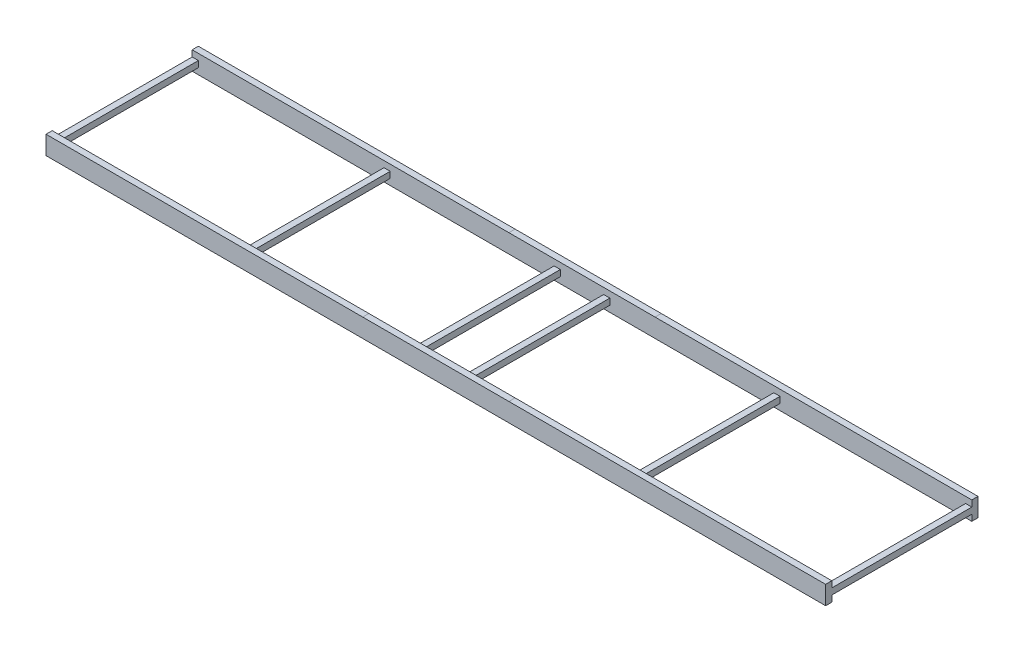
ISO-10303-21;
HEADER;
FILE_DESCRIPTION(('STEP AP214'),'2;1');
FILE_NAME('part.step','',(''),(''),'','','');
FILE_SCHEMA(('AUTOMOTIVE_DESIGN { 1 0 10303 214 1 1 1 1 }'));
ENDSEC;
DATA;
#1=APPLICATION_CONTEXT('core data for automotive mechanical design processes');
#2=APPLICATION_PROTOCOL_DEFINITION('international standard','automotive_design',2000,#1);
#3=PRODUCT_CONTEXT('',#1,'mechanical');
#4=PRODUCT('Part','Part','',(#3));
#5=PRODUCT_RELATED_PRODUCT_CATEGORY('part','',(#4));
#6=PRODUCT_DEFINITION_FORMATION('','',#4);
#7=PRODUCT_DEFINITION_CONTEXT('part definition',#1,'design');
#8=PRODUCT_DEFINITION('design','',#6,#7);
#9=PRODUCT_DEFINITION_SHAPE('','',#8);
#10=(LENGTH_UNIT() NAMED_UNIT(*) SI_UNIT(.MILLI.,.METRE.));
#11=(NAMED_UNIT(*) PLANE_ANGLE_UNIT() SI_UNIT($,.RADIAN.));
#12=(NAMED_UNIT(*) SI_UNIT($,.STERADIAN.) SOLID_ANGLE_UNIT());
#13=UNCERTAINTY_MEASURE_WITH_UNIT(LENGTH_MEASURE(1.E-05),#10,'distance_accuracy_value','');
#14=(GEOMETRIC_REPRESENTATION_CONTEXT(3) GLOBAL_UNCERTAINTY_ASSIGNED_CONTEXT((#13)) GLOBAL_UNIT_ASSIGNED_CONTEXT((#10,
#11,#12)) REPRESENTATION_CONTEXT('',''));
#15=CARTESIAN_POINT('',(0.,0.,0.));
#16=DIRECTION('',(0.,0.,1.));
#17=DIRECTION('',(1.,0.,0.));
#18=AXIS2_PLACEMENT_3D('',#15,#16,#17);
#19=CARTESIAN_POINT('',(-101.5875,4.7625,39.0875));
#20=DIRECTION('',(1.,0.,0.));
#21=DIRECTION('',(0.,0.,-1.));
#22=AXIS2_PLACEMENT_3D('',#19,#20,#21);
#23=PLANE('',#22);
#24=DIRECTION('',(0.,1.,0.));
#25=VECTOR('',#24,1.);
#26=CARTESIAN_POINT('',(-101.5875,4.7625,35.9125));
#27=LINE('',#26,#25);
#28=CARTESIAN_POINT('',(-101.5875,1.5875,35.9125));
#29=VERTEX_POINT('',#28);
#30=CARTESIAN_POINT('',(-101.5875,4.7625,35.9125));
#31=VERTEX_POINT('',#30);
#32=EDGE_CURVE('E506',#29,#31,#27,.T.);
#33=ORIENTED_EDGE('',*,*,#32,.T.);
#34=DIRECTION('',(0.,0.,-1.));
#35=VECTOR('',#34,1.);
#36=CARTESIAN_POINT('',(-101.5875,4.7625,39.0875));
#37=LINE('',#36,#35);
#38=CARTESIAN_POINT('',(-101.5875,4.7625,-35.9125));
#39=VERTEX_POINT('',#38);
#40=EDGE_CURVE('E490',#31,#39,#37,.T.);
#41=ORIENTED_EDGE('',*,*,#40,.T.);
#42=DIRECTION('',(0.,1.,0.));
#43=VECTOR('',#42,1.);
#44=CARTESIAN_POINT('',(-101.5875,4.7625,-35.9125));
#45=LINE('',#44,#43);
#46=CARTESIAN_POINT('',(-101.5875,1.5875,-35.9125));
#47=VERTEX_POINT('',#46);
#48=EDGE_CURVE('E54',#47,#39,#45,.T.);
#49=ORIENTED_EDGE('',*,*,#48,.F.);
#50=DIRECTION('',(0.,0.,-1.));
#51=VECTOR('',#50,1.);
#52=CARTESIAN_POINT('',(-101.5875,1.5875,39.0875));
#53=LINE('',#52,#51);
#54=EDGE_CURVE('E11',#29,#47,#53,.T.);
#55=ORIENTED_EDGE('',*,*,#54,.F.);
#56=EDGE_LOOP('',(#33,#41,#49,#55));
#57=FACE_BOUND('',#56,.T.);
#58=ADVANCED_FACE('F40',(#57),#23,.F.);
#59=CARTESIAN_POINT('',(-101.5875,1.5875,39.0875));
#60=DIRECTION('',(0.,1.,0.));
#61=DIRECTION('',(0.,0.,1.));
#62=AXIS2_PLACEMENT_3D('',#59,#60,#61);
#63=PLANE('',#62);
#64=DIRECTION('',(-1.,0.,0.));
#65=VECTOR('',#64,1.);
#66=CARTESIAN_POINT('',(200.,1.5875,35.9125));
#67=LINE('',#66,#65);
#68=CARTESIAN_POINT('',(-98.4125,1.5875,35.9125));
#69=VERTEX_POINT('',#68);
#70=EDGE_CURVE('E60',#69,#29,#67,.T.);
#71=ORIENTED_EDGE('',*,*,#70,.T.);
#72=ORIENTED_EDGE('',*,*,#54,.T.);
#73=DIRECTION('',(-1.,0.,0.));
#74=VECTOR('',#73,1.);
#75=CARTESIAN_POINT('',(200.,1.5875,-35.9125));
#76=LINE('',#75,#74);
#77=CARTESIAN_POINT('',(-98.4125,1.5875,-35.9125));
#78=VERTEX_POINT('',#77);
#79=EDGE_CURVE('E365',#78,#47,#76,.T.);
#80=ORIENTED_EDGE('',*,*,#79,.F.);
#81=DIRECTION('',(0.,0.,-1.));
#82=VECTOR('',#81,1.);
#83=CARTESIAN_POINT('',(-98.4125,1.5875,39.0875));
#84=LINE('',#83,#82);
#85=EDGE_CURVE('E47',#69,#78,#84,.T.);
#86=ORIENTED_EDGE('',*,*,#85,.F.);
#87=EDGE_LOOP('',(#71,#72,#80,#86));
#88=FACE_BOUND('',#87,.T.);
#89=ADVANCED_FACE('F766',(#88),#63,.F.);
#90=CARTESIAN_POINT('',(-98.4125,4.7625,39.0875));
#91=DIRECTION('',(-1.,0.,0.));
#92=DIRECTION('',(0.,0.,1.));
#93=AXIS2_PLACEMENT_3D('',#90,#91,#92);
#94=PLANE('',#93);
#95=DIRECTION('',(0.,1.,0.));
#96=VECTOR('',#95,1.);
#97=CARTESIAN_POINT('',(-98.4125,4.7625,35.9125));
#98=LINE('',#97,#96);
#99=CARTESIAN_POINT('',(-98.4125,4.7625,35.9125));
#100=VERTEX_POINT('',#99);
#101=EDGE_CURVE('E500',#69,#100,#98,.T.);
#102=ORIENTED_EDGE('',*,*,#101,.F.);
#103=ORIENTED_EDGE('',*,*,#85,.T.);
#104=DIRECTION('',(0.,1.,0.));
#105=VECTOR('',#104,1.);
#106=CARTESIAN_POINT('',(-98.4125,4.7625,-35.9125));
#107=LINE('',#106,#105);
#108=CARTESIAN_POINT('',(-98.4125,4.7625,-35.9125));
#109=VERTEX_POINT('',#108);
#110=EDGE_CURVE('E400',#78,#109,#107,.T.);
#111=ORIENTED_EDGE('',*,*,#110,.T.);
#112=DIRECTION('',(0.,0.,-1.));
#113=VECTOR('',#112,1.);
#114=CARTESIAN_POINT('',(-98.4125,4.7625,39.0875));
#115=LINE('',#114,#113);
#116=EDGE_CURVE('E492',#100,#109,#115,.T.);
#117=ORIENTED_EDGE('',*,*,#116,.F.);
#118=EDGE_LOOP('',(#102,#103,#111,#117));
#119=FACE_BOUND('',#118,.T.);
#120=ADVANCED_FACE('F496',(#119),#94,.F.);
#121=CARTESIAN_POINT('',(-101.5875,4.7625,39.0875));
#122=DIRECTION('',(0.,-1.,0.));
#123=DIRECTION('',(0.,0.,-1.));
#124=AXIS2_PLACEMENT_3D('',#121,#122,#123);
#125=PLANE('',#124);
#126=DIRECTION('',(-1.,0.,0.));
#127=VECTOR('',#126,1.);
#128=CARTESIAN_POINT('',(200.,4.7625,35.9125));
#129=LINE('',#128,#127);
#130=EDGE_CURVE('E512',#100,#31,#129,.T.);
#131=ORIENTED_EDGE('',*,*,#130,.F.);
#132=ORIENTED_EDGE('',*,*,#116,.T.);
#133=DIRECTION('',(-1.,0.,0.));
#134=VECTOR('',#133,1.);
#135=CARTESIAN_POINT('',(200.,4.7625,-35.9125));
#136=LINE('',#135,#134);
#137=EDGE_CURVE('E371',#109,#39,#136,.T.);
#138=ORIENTED_EDGE('',*,*,#137,.T.);
#139=ORIENTED_EDGE('',*,*,#40,.F.);
#140=EDGE_LOOP('',(#131,#132,#138,#139));
#141=FACE_BOUND('',#140,.T.);
#142=ADVANCED_FACE('F503',(#141),#125,.F.);
#143=CARTESIAN_POINT('',(-14.2875,4.7625,39.0875));
#144=DIRECTION('',(1.,0.,0.));
#145=DIRECTION('',(0.,0.,-1.));
#146=AXIS2_PLACEMENT_3D('',#143,#144,#145);
#147=PLANE('',#146);
#148=DIRECTION('',(0.,1.,0.));
#149=VECTOR('',#148,1.);
#150=CARTESIAN_POINT('',(-14.2875,4.7625,35.9125));
#151=LINE('',#150,#149);
#152=CARTESIAN_POINT('',(-14.2875,1.5875,35.9125));
#153=VERTEX_POINT('',#152);
#154=CARTESIAN_POINT('',(-14.2875,4.7625,35.9125));
#155=VERTEX_POINT('',#154);
#156=EDGE_CURVE('E529',#153,#155,#151,.T.);
#157=ORIENTED_EDGE('',*,*,#156,.T.);
#158=DIRECTION('',(0.,0.,-1.));
#159=VECTOR('',#158,1.);
#160=CARTESIAN_POINT('',(-14.2875,4.7625,39.0875));
#161=LINE('',#160,#159);
#162=CARTESIAN_POINT('',(-14.2875,4.7625,-35.9125));
#163=VERTEX_POINT('',#162);
#164=EDGE_CURVE('E480',#155,#163,#161,.T.);
#165=ORIENTED_EDGE('',*,*,#164,.T.);
#166=DIRECTION('',(0.,1.,0.));
#167=VECTOR('',#166,1.);
#168=CARTESIAN_POINT('',(-14.2875,4.7625,-35.9125));
#169=LINE('',#168,#167);
#170=CARTESIAN_POINT('',(-14.2875,1.5875,-35.9125));
#171=VERTEX_POINT('',#170);
#172=EDGE_CURVE('E376',#171,#163,#169,.T.);
#173=ORIENTED_EDGE('',*,*,#172,.F.);
#174=DIRECTION('',(0.,0.,-1.));
#175=VECTOR('',#174,1.);
#176=CARTESIAN_POINT('',(-14.2875,1.5875,39.0875));
#177=LINE('',#176,#175);
#178=EDGE_CURVE('E487',#153,#171,#177,.T.);
#179=ORIENTED_EDGE('',*,*,#178,.F.);
#180=EDGE_LOOP('',(#157,#165,#173,#179));
#181=FACE_BOUND('',#180,.T.);
#182=ADVANCED_FACE('F776',(#181),#147,.F.);
#183=CARTESIAN_POINT('',(-14.2875,1.5875,39.0875));
#184=DIRECTION('',(0.,1.,0.));
#185=DIRECTION('',(0.,0.,1.));
#186=AXIS2_PLACEMENT_3D('',#183,#184,#185);
#187=PLANE('',#186);
#188=CARTESIAN_POINT('',(-11.1125,1.5875,35.9125));
#189=VERTEX_POINT('',#188);
#190=EDGE_CURVE('E552',#189,#153,#67,.T.);
#191=ORIENTED_EDGE('',*,*,#190,.T.);
#192=ORIENTED_EDGE('',*,*,#178,.T.);
#193=CARTESIAN_POINT('',(-11.1125,1.5875,-35.9125));
#194=VERTEX_POINT('',#193);
#195=EDGE_CURVE('E361',#194,#171,#76,.T.);
#196=ORIENTED_EDGE('',*,*,#195,.F.);
#197=DIRECTION('',(0.,0.,-1.));
#198=VECTOR('',#197,1.);
#199=CARTESIAN_POINT('',(-11.1125,1.5875,39.0875));
#200=LINE('',#199,#198);
#201=EDGE_CURVE('E485',#189,#194,#200,.T.);
#202=ORIENTED_EDGE('',*,*,#201,.F.);
#203=EDGE_LOOP('',(#191,#192,#196,#202));
#204=FACE_BOUND('',#203,.T.);
#205=ADVANCED_FACE('F684',(#204),#187,.F.);
#206=CARTESIAN_POINT('',(-11.1125,4.7625,39.0875));
#207=DIRECTION('',(-1.,0.,0.));
#208=DIRECTION('',(0.,0.,1.));
#209=AXIS2_PLACEMENT_3D('',#206,#207,#208);
#210=PLANE('',#209);
#211=DIRECTION('',(0.,1.,0.));
#212=VECTOR('',#211,1.);
#213=CARTESIAN_POINT('',(-11.1125,4.7625,35.9125));
#214=LINE('',#213,#212);
#215=CARTESIAN_POINT('',(-11.1125,4.7625,35.9125));
#216=VERTEX_POINT('',#215);
#217=EDGE_CURVE('E554',#189,#216,#214,.T.);
#218=ORIENTED_EDGE('',*,*,#217,.F.);
#219=ORIENTED_EDGE('',*,*,#201,.T.);
#220=DIRECTION('',(0.,1.,0.));
#221=VECTOR('',#220,1.);
#222=CARTESIAN_POINT('',(-11.1125,4.7625,-35.9125));
#223=LINE('',#222,#221);
#224=CARTESIAN_POINT('',(-11.1125,4.7625,-35.9125));
#225=VERTEX_POINT('',#224);
#226=EDGE_CURVE('E369',#194,#225,#223,.T.);
#227=ORIENTED_EDGE('',*,*,#226,.T.);
#228=DIRECTION('',(0.,0.,-1.));
#229=VECTOR('',#228,1.);
#230=CARTESIAN_POINT('',(-11.1125,4.7625,39.0875));
#231=LINE('',#230,#229);
#232=EDGE_CURVE('E483',#216,#225,#231,.T.);
#233=ORIENTED_EDGE('',*,*,#232,.F.);
#234=EDGE_LOOP('',(#218,#219,#227,#233));
#235=FACE_BOUND('',#234,.T.);
#236=ADVANCED_FACE('F686',(#235),#210,.F.);
#237=CARTESIAN_POINT('',(-14.2875,4.7625,39.0875));
#238=DIRECTION('',(0.,-1.,0.));
#239=DIRECTION('',(0.,0.,-1.));
#240=AXIS2_PLACEMENT_3D('',#237,#238,#239);
#241=PLANE('',#240);
#242=EDGE_CURVE('E515',#216,#155,#129,.T.);
#243=ORIENTED_EDGE('',*,*,#242,.F.);
#244=ORIENTED_EDGE('',*,*,#232,.T.);
#245=EDGE_CURVE('E374',#225,#163,#136,.T.);
#246=ORIENTED_EDGE('',*,*,#245,.T.);
#247=ORIENTED_EDGE('',*,*,#164,.F.);
#248=EDGE_LOOP('',(#243,#244,#246,#247));
#249=FACE_BOUND('',#248,.T.);
#250=ADVANCED_FACE('F688',(#249),#241,.F.);
#251=CARTESIAN_POINT('',(11.1125,4.7625,39.0875));
#252=DIRECTION('',(1.,0.,0.));
#253=DIRECTION('',(0.,0.,-1.));
#254=AXIS2_PLACEMENT_3D('',#251,#252,#253);
#255=PLANE('',#254);
#256=DIRECTION('',(0.,1.,0.));
#257=VECTOR('',#256,1.);
#258=CARTESIAN_POINT('',(11.1125,4.7625,35.9125));
#259=LINE('',#258,#257);
#260=CARTESIAN_POINT('',(11.1125,1.5875,35.9125));
#261=VERTEX_POINT('',#260);
#262=CARTESIAN_POINT('',(11.1125,4.7625,35.9125));
#263=VERTEX_POINT('',#262);
#264=EDGE_CURVE('E464',#261,#263,#259,.T.);
#265=ORIENTED_EDGE('',*,*,#264,.T.);
#266=DIRECTION('',(0.,0.,-1.));
#267=VECTOR('',#266,1.);
#268=CARTESIAN_POINT('',(11.1125,4.7625,39.0875));
#269=LINE('',#268,#267);
#270=CARTESIAN_POINT('',(11.1125,4.7625,-35.9125));
#271=VERTEX_POINT('',#270);
#272=EDGE_CURVE('E456',#263,#271,#269,.T.);
#273=ORIENTED_EDGE('',*,*,#272,.T.);
#274=DIRECTION('',(0.,1.,0.));
#275=VECTOR('',#274,1.);
#276=CARTESIAN_POINT('',(11.1125,4.7625,-35.9125));
#277=LINE('',#276,#275);
#278=CARTESIAN_POINT('',(11.1125,1.5875,-35.9125));
#279=VERTEX_POINT('',#278);
#280=EDGE_CURVE('E398',#279,#271,#277,.T.);
#281=ORIENTED_EDGE('',*,*,#280,.F.);
#282=DIRECTION('',(0.,0.,-1.));
#283=VECTOR('',#282,1.);
#284=CARTESIAN_POINT('',(11.1125,1.5875,39.0875));
#285=LINE('',#284,#283);
#286=EDGE_CURVE('E478',#261,#279,#285,.T.);
#287=ORIENTED_EDGE('',*,*,#286,.F.);
#288=EDGE_LOOP('',(#265,#273,#281,#287));
#289=FACE_BOUND('',#288,.T.);
#290=ADVANCED_FACE('F460',(#289),#255,.F.);
#291=CARTESIAN_POINT('',(11.1125,1.5875,39.0875));
#292=DIRECTION('',(0.,1.,0.));
#293=DIRECTION('',(0.,0.,1.));
#294=AXIS2_PLACEMENT_3D('',#291,#292,#293);
#295=PLANE('',#294);
#296=CARTESIAN_POINT('',(14.2875,1.5875,35.9125));
#297=VERTEX_POINT('',#296);
#298=EDGE_CURVE('E580',#297,#261,#67,.T.);
#299=ORIENTED_EDGE('',*,*,#298,.T.);
#300=ORIENTED_EDGE('',*,*,#286,.T.);
#301=CARTESIAN_POINT('',(14.2875,1.5875,-35.9125));
#302=VERTEX_POINT('',#301);
#303=EDGE_CURVE('E344',#302,#279,#76,.T.);
#304=ORIENTED_EDGE('',*,*,#303,.F.);
#305=DIRECTION('',(0.,0.,-1.));
#306=VECTOR('',#305,1.);
#307=CARTESIAN_POINT('',(14.2875,1.5875,39.0875));
#308=LINE('',#307,#306);
#309=EDGE_CURVE('E468',#297,#302,#308,.T.);
#310=ORIENTED_EDGE('',*,*,#309,.F.);
#311=EDGE_LOOP('',(#299,#300,#304,#310));
#312=FACE_BOUND('',#311,.T.);
#313=ADVANCED_FACE('F679',(#312),#295,.F.);
#314=CARTESIAN_POINT('',(14.2875,4.7625,39.0875));
#315=DIRECTION('',(-1.,0.,0.));
#316=DIRECTION('',(0.,0.,1.));
#317=AXIS2_PLACEMENT_3D('',#314,#315,#316);
#318=PLANE('',#317);
#319=DIRECTION('',(0.,1.,0.));
#320=VECTOR('',#319,1.);
#321=CARTESIAN_POINT('',(14.2875,4.7625,35.9125));
#322=LINE('',#321,#320);
#323=CARTESIAN_POINT('',(14.2875,4.7625,35.9125));
#324=VERTEX_POINT('',#323);
#325=EDGE_CURVE('E559',#297,#324,#322,.T.);
#326=ORIENTED_EDGE('',*,*,#325,.F.);
#327=ORIENTED_EDGE('',*,*,#309,.T.);
#328=DIRECTION('',(0.,1.,0.));
#329=VECTOR('',#328,1.);
#330=CARTESIAN_POINT('',(14.2875,4.7625,-35.9125));
#331=LINE('',#330,#329);
#332=CARTESIAN_POINT('',(14.2875,4.7625,-35.9125));
#333=VERTEX_POINT('',#332);
#334=EDGE_CURVE('E413',#302,#333,#331,.T.);
#335=ORIENTED_EDGE('',*,*,#334,.T.);
#336=DIRECTION('',(0.,0.,-1.));
#337=VECTOR('',#336,1.);
#338=CARTESIAN_POINT('',(14.2875,4.7625,39.0875));
#339=LINE('',#338,#337);
#340=EDGE_CURVE('E458',#324,#333,#339,.T.);
#341=ORIENTED_EDGE('',*,*,#340,.F.);
#342=EDGE_LOOP('',(#326,#327,#335,#341));
#343=FACE_BOUND('',#342,.T.);
#344=ADVANCED_FACE('F676',(#343),#318,.F.);
#345=CARTESIAN_POINT('',(11.1125,4.7625,39.0875));
#346=DIRECTION('',(0.,-1.,0.));
#347=DIRECTION('',(0.,0.,-1.));
#348=AXIS2_PLACEMENT_3D('',#345,#346,#347);
#349=PLANE('',#348);
#350=EDGE_CURVE('E519',#324,#263,#129,.T.);
#351=ORIENTED_EDGE('',*,*,#350,.F.);
#352=ORIENTED_EDGE('',*,*,#340,.T.);
#353=EDGE_CURVE('E396',#333,#271,#136,.T.);
#354=ORIENTED_EDGE('',*,*,#353,.T.);
#355=ORIENTED_EDGE('',*,*,#272,.F.);
#356=EDGE_LOOP('',(#351,#352,#354,#355));
#357=FACE_BOUND('',#356,.T.);
#358=ADVANCED_FACE('F455',(#357),#349,.F.);
#359=CARTESIAN_POINT('',(98.4125,4.7625,39.0875));
#360=DIRECTION('',(1.,0.,0.));
#361=DIRECTION('',(0.,0.,-1.));
#362=AXIS2_PLACEMENT_3D('',#359,#360,#361);
#363=PLANE('',#362);
#364=DIRECTION('',(0.,1.,0.));
#365=VECTOR('',#364,1.);
#366=CARTESIAN_POINT('',(98.4125,4.7625,35.9125));
#367=LINE('',#366,#365);
#368=CARTESIAN_POINT('',(98.4125,1.5875,35.9125));
#369=VERTEX_POINT('',#368);
#370=CARTESIAN_POINT('',(98.4125,4.7625,35.9125));
#371=VERTEX_POINT('',#370);
#372=EDGE_CURVE('E556',#369,#371,#367,.T.);
#373=ORIENTED_EDGE('',*,*,#372,.T.);
#374=DIRECTION('',(0.,0.,-1.));
#375=VECTOR('',#374,1.);
#376=CARTESIAN_POINT('',(98.4125,4.7625,39.0875));
#377=LINE('',#376,#375);
#378=CARTESIAN_POINT('',(98.4125,4.7625,-35.9125));
#379=VERTEX_POINT('',#378);
#380=EDGE_CURVE('E659',#371,#379,#377,.T.);
#381=ORIENTED_EDGE('',*,*,#380,.T.);
#382=DIRECTION('',(0.,1.,0.));
#383=VECTOR('',#382,1.);
#384=CARTESIAN_POINT('',(98.4125,4.7625,-35.9125));
#385=LINE('',#384,#383);
#386=CARTESIAN_POINT('',(98.4125,1.5875,-35.9125));
#387=VERTEX_POINT('',#386);
#388=EDGE_CURVE('E406',#387,#379,#385,.T.);
#389=ORIENTED_EDGE('',*,*,#388,.F.);
#390=DIRECTION('',(0.,0.,-1.));
#391=VECTOR('',#390,1.);
#392=CARTESIAN_POINT('',(98.4125,1.5875,39.0875));
#393=LINE('',#392,#391);
#394=EDGE_CURVE('E466',#369,#387,#393,.T.);
#395=ORIENTED_EDGE('',*,*,#394,.F.);
#396=EDGE_LOOP('',(#373,#381,#389,#395));
#397=FACE_BOUND('',#396,.T.);
#398=ADVANCED_FACE('F674',(#397),#363,.F.);
#399=CARTESIAN_POINT('',(98.4125,1.5875,39.0875));
#400=DIRECTION('',(0.,1.,0.));
#401=DIRECTION('',(0.,0.,1.));
#402=AXIS2_PLACEMENT_3D('',#399,#400,#401);
#403=PLANE('',#402);
#404=CARTESIAN_POINT('',(101.5875,1.5875,35.9125));
#405=VERTEX_POINT('',#404);
#406=EDGE_CURVE('E581',#405,#369,#67,.T.);
#407=ORIENTED_EDGE('',*,*,#406,.T.);
#408=ORIENTED_EDGE('',*,*,#394,.T.);
#409=CARTESIAN_POINT('',(101.5875,1.5875,-35.9125));
#410=VERTEX_POINT('',#409);
#411=EDGE_CURVE('E340',#410,#387,#76,.T.);
#412=ORIENTED_EDGE('',*,*,#411,.F.);
#413=DIRECTION('',(0.,0.,-1.));
#414=VECTOR('',#413,1.);
#415=CARTESIAN_POINT('',(101.5875,1.5875,39.0875));
#416=LINE('',#415,#414);
#417=EDGE_CURVE('E471',#405,#410,#416,.T.);
#418=ORIENTED_EDGE('',*,*,#417,.F.);
#419=EDGE_LOOP('',(#407,#408,#412,#418));
#420=FACE_BOUND('',#419,.T.);
#421=ADVANCED_FACE('F673',(#420),#403,.F.);
#422=CARTESIAN_POINT('',(101.5875,4.7625,39.0875));
#423=DIRECTION('',(-1.,0.,0.));
#424=DIRECTION('',(0.,0.,1.));
#425=AXIS2_PLACEMENT_3D('',#422,#423,#424);
#426=PLANE('',#425);
#427=DIRECTION('',(0.,1.,0.));
#428=VECTOR('',#427,1.);
#429=CARTESIAN_POINT('',(101.5875,4.7625,35.9125));
#430=LINE('',#429,#428);
#431=CARTESIAN_POINT('',(101.5875,4.7625,35.9125));
#432=VERTEX_POINT('',#431);
#433=EDGE_CURVE('E569',#405,#432,#430,.T.);
#434=ORIENTED_EDGE('',*,*,#433,.F.);
#435=ORIENTED_EDGE('',*,*,#417,.T.);
#436=DIRECTION('',(0.,1.,0.));
#437=VECTOR('',#436,1.);
#438=CARTESIAN_POINT('',(101.5875,4.7625,-35.9125));
#439=LINE('',#438,#437);
#440=CARTESIAN_POINT('',(101.5875,4.7625,-35.9125));
#441=VERTEX_POINT('',#440);
#442=EDGE_CURVE('E422',#410,#441,#439,.T.);
#443=ORIENTED_EDGE('',*,*,#442,.T.);
#444=DIRECTION('',(0.,0.,-1.));
#445=VECTOR('',#444,1.);
#446=CARTESIAN_POINT('',(101.5875,4.7625,39.0875));
#447=LINE('',#446,#445);
#448=EDGE_CURVE('E666',#432,#441,#447,.T.);
#449=ORIENTED_EDGE('',*,*,#448,.F.);
#450=EDGE_LOOP('',(#434,#435,#443,#449));
#451=FACE_BOUND('',#450,.T.);
#452=ADVANCED_FACE('F670',(#451),#426,.F.);
#453=CARTESIAN_POINT('',(98.4125,4.7625,39.0875));
#454=DIRECTION('',(0.,-1.,0.));
#455=DIRECTION('',(0.,0.,-1.));
#456=AXIS2_PLACEMENT_3D('',#453,#454,#455);
#457=PLANE('',#456);
#458=EDGE_CURVE('E540',#432,#371,#129,.T.);
#459=ORIENTED_EDGE('',*,*,#458,.F.);
#460=ORIENTED_EDGE('',*,*,#448,.T.);
#461=EDGE_CURVE('E388',#441,#379,#136,.T.);
#462=ORIENTED_EDGE('',*,*,#461,.T.);
#463=ORIENTED_EDGE('',*,*,#380,.F.);
#464=EDGE_LOOP('',(#459,#460,#462,#463));
#465=FACE_BOUND('',#464,.T.);
#466=ADVANCED_FACE('F803',(#465),#457,.F.);
#467=CARTESIAN_POINT('',(-196.825,4.7625,-39.0875));
#468=DIRECTION('',(-1.,0.,0.));
#469=DIRECTION('',(0.,0.,1.));
#470=AXIS2_PLACEMENT_3D('',#467,#468,#469);
#471=PLANE('',#470);
#472=DIRECTION('',(0.,1.,0.));
#473=VECTOR('',#472,1.);
#474=CARTESIAN_POINT('',(-196.825,4.7625,35.9125));
#475=LINE('',#474,#473);
#476=CARTESIAN_POINT('',(-196.825,1.5875,35.9125));
#477=VERTEX_POINT('',#476);
#478=CARTESIAN_POINT('',(-196.825,4.7625,35.9125));
#479=VERTEX_POINT('',#478);
#480=EDGE_CURVE('E510',#477,#479,#475,.T.);
#481=ORIENTED_EDGE('',*,*,#480,.F.);
#482=DIRECTION('',(0.,0.,1.));
#483=VECTOR('',#482,1.);
#484=CARTESIAN_POINT('',(-196.825,1.5875,-39.0875));
#485=LINE('',#484,#483);
#486=CARTESIAN_POINT('',(-196.825,1.5875,-35.9125));
#487=VERTEX_POINT('',#486);
#488=EDGE_CURVE('E656',#487,#477,#485,.T.);
#489=ORIENTED_EDGE('',*,*,#488,.F.);
#490=DIRECTION('',(0.,1.,0.));
#491=VECTOR('',#490,1.);
#492=CARTESIAN_POINT('',(-196.825,4.7625,-35.9125));
#493=LINE('',#492,#491);
#494=CARTESIAN_POINT('',(-196.825,4.7625,-35.9125));
#495=VERTEX_POINT('',#494);
#496=EDGE_CURVE('E645',#487,#495,#493,.T.);
#497=ORIENTED_EDGE('',*,*,#496,.T.);
#498=DIRECTION('',(0.,0.,1.));
#499=VECTOR('',#498,1.);
#500=CARTESIAN_POINT('',(-196.825,4.7625,-39.0875));
#501=LINE('',#500,#499);
#502=EDGE_CURVE('E661',#495,#479,#501,.T.);
#503=ORIENTED_EDGE('',*,*,#502,.T.);
#504=EDGE_LOOP('',(#481,#489,#497,#503));
#505=FACE_BOUND('',#504,.T.);
#506=ADVANCED_FACE('F715',(#505),#471,.F.);
#507=CARTESIAN_POINT('',(-196.825,1.5875,-39.0875));
#508=DIRECTION('',(0.,1.,0.));
#509=DIRECTION('',(0.,0.,1.));
#510=AXIS2_PLACEMENT_3D('',#507,#508,#509);
#511=PLANE('',#510);
#512=CARTESIAN_POINT('',(-200.,1.5875,35.9125));
#513=VERTEX_POINT('',#512);
#514=EDGE_CURVE('E642',#477,#513,#67,.T.);
#515=ORIENTED_EDGE('',*,*,#514,.T.);
#516=DIRECTION('',(0.,0.,1.));
#517=VECTOR('',#516,1.);
#518=CARTESIAN_POINT('',(-200.,1.5875,-39.0875));
#519=LINE('',#518,#517);
#520=CARTESIAN_POINT('',(-200.,1.5875,-35.9125));
#521=VERTEX_POINT('',#520);
#522=EDGE_CURVE('E638',#521,#513,#519,.T.);
#523=ORIENTED_EDGE('',*,*,#522,.F.);
#524=EDGE_CURVE('E306',#487,#521,#76,.T.);
#525=ORIENTED_EDGE('',*,*,#524,.F.);
#526=ORIENTED_EDGE('',*,*,#488,.T.);
#527=EDGE_LOOP('',(#515,#523,#525,#526));
#528=FACE_BOUND('',#527,.T.);
#529=ADVANCED_FACE('F655',(#528),#511,.F.);
#530=CARTESIAN_POINT('',(-196.825,4.7625,-39.0875));
#531=DIRECTION('',(0.,-1.,0.));
#532=DIRECTION('',(0.,0.,-1.));
#533=AXIS2_PLACEMENT_3D('',#530,#531,#532);
#534=PLANE('',#533);
#535=CARTESIAN_POINT('',(-200.,4.7625,35.9125));
#536=VERTEX_POINT('',#535);
#537=EDGE_CURVE('E516',#479,#536,#129,.T.);
#538=ORIENTED_EDGE('',*,*,#537,.F.);
#539=ORIENTED_EDGE('',*,*,#502,.F.);
#540=CARTESIAN_POINT('',(-200.,4.7625,-35.9125));
#541=VERTEX_POINT('',#540);
#542=EDGE_CURVE('E375',#495,#541,#136,.T.);
#543=ORIENTED_EDGE('',*,*,#542,.T.);
#544=DIRECTION('',(0.,0.,1.));
#545=VECTOR('',#544,1.);
#546=CARTESIAN_POINT('',(-200.,4.7625,-39.0875));
#547=LINE('',#546,#545);
#548=EDGE_CURVE('E657',#541,#536,#547,.T.);
#549=ORIENTED_EDGE('',*,*,#548,.T.);
#550=EDGE_LOOP('',(#538,#539,#543,#549));
#551=FACE_BOUND('',#550,.T.);
#552=ADVANCED_FACE('F810',(#551),#534,.F.);
#553=CARTESIAN_POINT('',(-200.,4.7625,-39.0875));
#554=DIRECTION('',(1.,0.,0.));
#555=DIRECTION('',(0.,0.,-1.));
#556=AXIS2_PLACEMENT_3D('',#553,#554,#555);
#557=PLANE('',#556);
#558=DIRECTION('',(0.,1.,0.));
#559=VECTOR('',#558,1.);
#560=CARTESIAN_POINT('',(-200.,4.7625,39.0875));
#561=LINE('',#560,#559);
#562=CARTESIAN_POINT('',(-200.,-1.5875,39.0875));
#563=VERTEX_POINT('',#562);
#564=CARTESIAN_POINT('',(-200.,7.9375,39.0875));
#565=VERTEX_POINT('',#564);
#566=EDGE_CURVE('E711',#563,#565,#561,.T.);
#567=ORIENTED_EDGE('',*,*,#566,.T.);
#568=DIRECTION('',(0.,0.,1.));
#569=VECTOR('',#568,1.);
#570=CARTESIAN_POINT('',(-200.,7.9375,39.0875));
#571=LINE('',#570,#569);
#572=CARTESIAN_POINT('',(-200.,7.9375,35.9125));
#573=VERTEX_POINT('',#572);
#574=EDGE_CURVE('E724',#573,#565,#571,.T.);
#575=ORIENTED_EDGE('',*,*,#574,.F.);
#576=DIRECTION('',(0.,1.,0.));
#577=VECTOR('',#576,1.);
#578=CARTESIAN_POINT('',(-200.,7.9375,35.9125));
#579=LINE('',#578,#577);
#580=EDGE_CURVE('E605',#536,#573,#579,.T.);
#581=ORIENTED_EDGE('',*,*,#580,.F.);
#582=ORIENTED_EDGE('',*,*,#548,.F.);
#583=DIRECTION('',(0.,1.,0.));
#584=VECTOR('',#583,1.);
#585=CARTESIAN_POINT('',(-200.,7.9375,-35.9125));
#586=LINE('',#585,#584);
#587=CARTESIAN_POINT('',(-200.,7.9375,-35.9125));
#588=VERTEX_POINT('',#587);
#589=EDGE_CURVE('E854',#541,#588,#586,.T.);
#590=ORIENTED_EDGE('',*,*,#589,.T.);
#591=DIRECTION('',(0.,0.,-1.));
#592=VECTOR('',#591,1.);
#593=CARTESIAN_POINT('',(-200.,7.9375,-39.0875));
#594=LINE('',#593,#592);
#595=CARTESIAN_POINT('',(-200.,7.9375,-39.0875));
#596=VERTEX_POINT('',#595);
#597=EDGE_CURVE('E857',#588,#596,#594,.T.);
#598=ORIENTED_EDGE('',*,*,#597,.T.);
#599=DIRECTION('',(0.,1.,0.));
#600=VECTOR('',#599,1.);
#601=CARTESIAN_POINT('',(-200.,4.7625,-39.0875));
#602=LINE('',#601,#600);
#603=CARTESIAN_POINT('',(-200.,-1.5875,-39.0875));
#604=VERTEX_POINT('',#603);
#605=EDGE_CURVE('E709',#604,#596,#602,.T.);
#606=ORIENTED_EDGE('',*,*,#605,.F.);
#607=DIRECTION('',(0.,0.,-1.));
#608=VECTOR('',#607,1.);
#609=CARTESIAN_POINT('',(-200.,-1.5875,-35.9125));
#610=LINE('',#609,#608);
#611=CARTESIAN_POINT('',(-200.,-1.5875,-35.9125));
#612=VERTEX_POINT('',#611);
#613=EDGE_CURVE('E315',#612,#604,#610,.T.);
#614=ORIENTED_EDGE('',*,*,#613,.F.);
#615=DIRECTION('',(0.,-1.,0.));
#616=VECTOR('',#615,1.);
#617=CARTESIAN_POINT('',(-200.,1.5875,-35.9125));
#618=LINE('',#617,#616);
#619=EDGE_CURVE('E651',#521,#612,#618,.T.);
#620=ORIENTED_EDGE('',*,*,#619,.F.);
#621=ORIENTED_EDGE('',*,*,#522,.T.);
#622=DIRECTION('',(0.,1.,0.));
#623=VECTOR('',#622,1.);
#624=CARTESIAN_POINT('',(-200.,1.5875,35.9125));
#625=LINE('',#624,#623);
#626=CARTESIAN_POINT('',(-200.,-1.5875,35.9125));
#627=VERTEX_POINT('',#626);
#628=EDGE_CURVE('E585',#627,#513,#625,.T.);
#629=ORIENTED_EDGE('',*,*,#628,.F.);
#630=DIRECTION('',(0.,0.,-1.));
#631=VECTOR('',#630,1.);
#632=CARTESIAN_POINT('',(-200.,-1.5875,39.0875));
#633=LINE('',#632,#631);
#634=EDGE_CURVE('E631',#563,#627,#633,.T.);
#635=ORIENTED_EDGE('',*,*,#634,.F.);
#636=EDGE_LOOP('',(#567,#575,#581,#582,#590,#598,#606,#614,#620,#621,#629,#635));
#637=FACE_BOUND('',#636,.T.);
#638=ADVANCED_FACE('F635',(#637),#557,.F.);
#639=CARTESIAN_POINT('',(200.,1.5875,-39.0875));
#640=DIRECTION('',(0.,1.,0.));
#641=DIRECTION('',(0.,0.,1.));
#642=AXIS2_PLACEMENT_3D('',#639,#640,#641);
#643=PLANE('',#642);
#644=CARTESIAN_POINT('',(200.,1.5875,-35.9125));
#645=VERTEX_POINT('',#644);
#646=CARTESIAN_POINT('',(196.825,1.5875,-35.9125));
#647=VERTEX_POINT('',#646);
#648=EDGE_CURVE('E338',#645,#647,#76,.T.);
#649=ORIENTED_EDGE('',*,*,#648,.F.);
#650=DIRECTION('',(0.,0.,1.));
#651=VECTOR('',#650,1.);
#652=CARTESIAN_POINT('',(200.,1.5875,-39.0875));
#653=LINE('',#652,#651);
#654=CARTESIAN_POINT('',(200.,1.5875,35.9125));
#655=VERTEX_POINT('',#654);
#656=EDGE_CURVE('E312',#645,#655,#653,.T.);
#657=ORIENTED_EDGE('',*,*,#656,.T.);
#658=CARTESIAN_POINT('',(196.825,1.5875,35.9125));
#659=VERTEX_POINT('',#658);
#660=EDGE_CURVE('E597',#655,#659,#67,.T.);
#661=ORIENTED_EDGE('',*,*,#660,.T.);
#662=DIRECTION('',(0.,0.,1.));
#663=VECTOR('',#662,1.);
#664=CARTESIAN_POINT('',(196.825,1.5875,-39.0875));
#665=LINE('',#664,#663);
#666=EDGE_CURVE('E707',#647,#659,#665,.T.);
#667=ORIENTED_EDGE('',*,*,#666,.F.);
#668=EDGE_LOOP('',(#649,#657,#661,#667));
#669=FACE_BOUND('',#668,.T.);
#670=ADVANCED_FACE('F813',(#669),#643,.F.);
#671=CARTESIAN_POINT('',(196.825,4.7625,-39.0875));
#672=DIRECTION('',(1.,0.,0.));
#673=DIRECTION('',(0.,0.,-1.));
#674=AXIS2_PLACEMENT_3D('',#671,#672,#673);
#675=PLANE('',#674);
#676=DIRECTION('',(0.,1.,0.));
#677=VECTOR('',#676,1.);
#678=CARTESIAN_POINT('',(196.825,4.7625,-35.9125));
#679=LINE('',#678,#677);
#680=CARTESIAN_POINT('',(196.825,4.7625,-35.9125));
#681=VERTEX_POINT('',#680);
#682=EDGE_CURVE('E417',#647,#681,#679,.T.);
#683=ORIENTED_EDGE('',*,*,#682,.F.);
#684=ORIENTED_EDGE('',*,*,#666,.T.);
#685=DIRECTION('',(0.,1.,0.));
#686=VECTOR('',#685,1.);
#687=CARTESIAN_POINT('',(196.825,4.7625,35.9125));
#688=LINE('',#687,#686);
#689=CARTESIAN_POINT('',(196.825,4.7625,35.9125));
#690=VERTEX_POINT('',#689);
#691=EDGE_CURVE('E565',#659,#690,#688,.T.);
#692=ORIENTED_EDGE('',*,*,#691,.T.);
#693=DIRECTION('',(0.,0.,1.));
#694=VECTOR('',#693,1.);
#695=CARTESIAN_POINT('',(196.825,4.7625,-39.0875));
#696=LINE('',#695,#694);
#697=EDGE_CURVE('E700',#681,#690,#696,.T.);
#698=ORIENTED_EDGE('',*,*,#697,.F.);
#699=EDGE_LOOP('',(#683,#684,#692,#698));
#700=FACE_BOUND('',#699,.T.);
#701=ADVANCED_FACE('F821',(#700),#675,.F.);
#702=CARTESIAN_POINT('',(200.,4.7625,-39.0875));
#703=DIRECTION('',(0.,-1.,0.));
#704=DIRECTION('',(0.,0.,-1.));
#705=AXIS2_PLACEMENT_3D('',#702,#703,#704);
#706=PLANE('',#705);
#707=CARTESIAN_POINT('',(200.,4.7625,-35.9125));
#708=VERTEX_POINT('',#707);
#709=EDGE_CURVE('E394',#708,#681,#136,.T.);
#710=ORIENTED_EDGE('',*,*,#709,.T.);
#711=ORIENTED_EDGE('',*,*,#697,.T.);
#712=CARTESIAN_POINT('',(200.,4.7625,35.9125));
#713=VERTEX_POINT('',#712);
#714=EDGE_CURVE('E545',#713,#690,#129,.T.);
#715=ORIENTED_EDGE('',*,*,#714,.F.);
#716=DIRECTION('',(0.,0.,1.));
#717=VECTOR('',#716,1.);
#718=CARTESIAN_POINT('',(200.,4.7625,-39.0875));
#719=LINE('',#718,#717);
#720=EDGE_CURVE('E697',#708,#713,#719,.T.);
#721=ORIENTED_EDGE('',*,*,#720,.F.);
#722=EDGE_LOOP('',(#710,#711,#715,#721));
#723=FACE_BOUND('',#722,.T.);
#724=ADVANCED_FACE('F818',(#723),#706,.F.);
#725=CARTESIAN_POINT('',(200.,4.7625,-39.0875));
#726=DIRECTION('',(-1.,0.,0.));
#727=DIRECTION('',(0.,0.,1.));
#728=AXIS2_PLACEMENT_3D('',#725,#726,#727);
#729=PLANE('',#728);
#730=DIRECTION('',(0.,-1.,0.));
#731=VECTOR('',#730,1.);
#732=CARTESIAN_POINT('',(200.,4.7625,39.0875));
#733=LINE('',#732,#731);
#734=CARTESIAN_POINT('',(200.,7.9375,39.0875));
#735=VERTEX_POINT('',#734);
#736=CARTESIAN_POINT('',(200.,-1.5875,39.0875));
#737=VERTEX_POINT('',#736);
#738=EDGE_CURVE('E509',#735,#737,#733,.T.);
#739=ORIENTED_EDGE('',*,*,#738,.T.);
#740=DIRECTION('',(0.,0.,-1.));
#741=VECTOR('',#740,1.);
#742=CARTESIAN_POINT('',(200.,-1.5875,39.0875));
#743=LINE('',#742,#741);
#744=CARTESIAN_POINT('',(200.,-1.5875,35.9125));
#745=VERTEX_POINT('',#744);
#746=EDGE_CURVE('E639',#737,#745,#743,.T.);
#747=ORIENTED_EDGE('',*,*,#746,.T.);
#748=DIRECTION('',(0.,1.,0.));
#749=VECTOR('',#748,1.);
#750=CARTESIAN_POINT('',(200.,1.5875,35.9125));
#751=LINE('',#750,#749);
#752=EDGE_CURVE('E640',#745,#655,#751,.T.);
#753=ORIENTED_EDGE('',*,*,#752,.T.);
#754=ORIENTED_EDGE('',*,*,#656,.F.);
#755=DIRECTION('',(0.,-1.,0.));
#756=VECTOR('',#755,1.);
#757=CARTESIAN_POINT('',(200.,1.5875,-35.9125));
#758=LINE('',#757,#756);
#759=CARTESIAN_POINT('',(200.,-1.5875,-35.9125));
#760=VERTEX_POINT('',#759);
#761=EDGE_CURVE('E307',#645,#760,#758,.T.);
#762=ORIENTED_EDGE('',*,*,#761,.T.);
#763=DIRECTION('',(0.,0.,-1.));
#764=VECTOR('',#763,1.);
#765=CARTESIAN_POINT('',(200.,-1.5875,-35.9125));
#766=LINE('',#765,#764);
#767=CARTESIAN_POINT('',(200.,-1.5875,-39.0875));
#768=VERTEX_POINT('',#767);
#769=EDGE_CURVE('E298',#760,#768,#766,.T.);
#770=ORIENTED_EDGE('',*,*,#769,.T.);
#771=DIRECTION('',(0.,-1.,0.));
#772=VECTOR('',#771,1.);
#773=CARTESIAN_POINT('',(200.,4.7625,-39.0875));
#774=LINE('',#773,#772);
#775=CARTESIAN_POINT('',(200.,7.9375,-39.0875));
#776=VERTEX_POINT('',#775);
#777=EDGE_CURVE('E695',#776,#768,#774,.T.);
#778=ORIENTED_EDGE('',*,*,#777,.F.);
#779=DIRECTION('',(0.,0.,-1.));
#780=VECTOR('',#779,1.);
#781=CARTESIAN_POINT('',(200.,7.9375,-39.0875));
#782=LINE('',#781,#780);
#783=CARTESIAN_POINT('',(200.,7.9375,-35.9125));
#784=VERTEX_POINT('',#783);
#785=EDGE_CURVE('E863',#784,#776,#782,.T.);
#786=ORIENTED_EDGE('',*,*,#785,.F.);
#787=DIRECTION('',(0.,1.,0.));
#788=VECTOR('',#787,1.);
#789=CARTESIAN_POINT('',(200.,7.9375,-35.9125));
#790=LINE('',#789,#788);
#791=EDGE_CURVE('E860',#708,#784,#790,.T.);
#792=ORIENTED_EDGE('',*,*,#791,.F.);
#793=ORIENTED_EDGE('',*,*,#720,.T.);
#794=DIRECTION('',(0.,1.,0.));
#795=VECTOR('',#794,1.);
#796=CARTESIAN_POINT('',(200.,7.9375,35.9125));
#797=LINE('',#796,#795);
#798=CARTESIAN_POINT('',(200.,7.9375,35.9125));
#799=VERTEX_POINT('',#798);
#800=EDGE_CURVE('E726',#713,#799,#797,.T.);
#801=ORIENTED_EDGE('',*,*,#800,.T.);
#802=DIRECTION('',(0.,0.,1.));
#803=VECTOR('',#802,1.);
#804=CARTESIAN_POINT('',(200.,7.9375,39.0875));
#805=LINE('',#804,#803);
#806=EDGE_CURVE('E729',#799,#735,#805,.T.);
#807=ORIENTED_EDGE('',*,*,#806,.T.);
#808=EDGE_LOOP('',(#739,#747,#753,#754,#762,#770,#778,#786,#792,#793,#801,#807));
#809=FACE_BOUND('',#808,.T.);
#810=ADVANCED_FACE('F310',(#809),#729,.F.);
#811=CARTESIAN_POINT('',(-101.5875,4.7625,35.9125));
#812=DIRECTION('',(0.,0.,1.));
#813=DIRECTION('',(1.,0.,0.));
#814=AXIS2_PLACEMENT_3D('',#811,#812,#813);
#815=PLANE('',#814);
#816=ORIENTED_EDGE('',*,*,#514,.F.);
#817=ORIENTED_EDGE('',*,*,#480,.T.);
#818=ORIENTED_EDGE('',*,*,#537,.T.);
#819=ORIENTED_EDGE('',*,*,#580,.T.);
#820=DIRECTION('',(-1.,0.,0.));
#821=VECTOR('',#820,1.);
#822=CARTESIAN_POINT('',(200.,7.9375,35.9125));
#823=LINE('',#822,#821);
#824=CARTESIAN_POINT('',(-37.5,7.9375,35.9125));
#825=VERTEX_POINT('',#824);
#826=EDGE_CURVE('E732',#825,#573,#823,.T.);
#827=ORIENTED_EDGE('',*,*,#826,.F.);
#828=CARTESIAN_POINT('',(37.5,7.9375,35.9125));
#829=VERTEX_POINT('',#828);
#830=EDGE_CURVE('E738',#829,#825,#823,.T.);
#831=ORIENTED_EDGE('',*,*,#830,.F.);
#832=EDGE_CURVE('E522',#799,#829,#823,.T.);
#833=ORIENTED_EDGE('',*,*,#832,.F.);
#834=ORIENTED_EDGE('',*,*,#800,.F.);
#835=ORIENTED_EDGE('',*,*,#714,.T.);
#836=ORIENTED_EDGE('',*,*,#691,.F.);
#837=ORIENTED_EDGE('',*,*,#660,.F.);
#838=ORIENTED_EDGE('',*,*,#752,.F.);
#839=DIRECTION('',(-1.,0.,0.));
#840=VECTOR('',#839,1.);
#841=CARTESIAN_POINT('',(200.,-1.5875,35.9125));
#842=LINE('',#841,#840);
#843=CARTESIAN_POINT('',(175.,-1.5875,35.9125));
#844=VERTEX_POINT('',#843);
#845=EDGE_CURVE('E587',#745,#844,#842,.T.);
#846=ORIENTED_EDGE('',*,*,#845,.T.);
#847=CARTESIAN_POINT('',(-175.,-1.5875,35.9125));
#848=VERTEX_POINT('',#847);
#849=EDGE_CURVE('E621',#844,#848,#842,.T.);
#850=ORIENTED_EDGE('',*,*,#849,.T.);
#851=EDGE_CURVE('E601',#848,#627,#842,.T.);
#852=ORIENTED_EDGE('',*,*,#851,.T.);
#853=ORIENTED_EDGE('',*,*,#628,.T.);
#854=EDGE_LOOP('',(#816,#817,#818,#819,#827,#831,#833,#834,#835,#836,#837,#838,#846,#850,#852,#853));
#855=FACE_BOUND('',#854,.T.);
#856=ORIENTED_EDGE('',*,*,#32,.F.);
#857=ORIENTED_EDGE('',*,*,#70,.F.);
#858=ORIENTED_EDGE('',*,*,#101,.T.);
#859=ORIENTED_EDGE('',*,*,#130,.T.);
#860=EDGE_LOOP('',(#856,#857,#858,#859));
#861=FACE_BOUND('',#860,.T.);
#862=ORIENTED_EDGE('',*,*,#156,.F.);
#863=ORIENTED_EDGE('',*,*,#190,.F.);
#864=ORIENTED_EDGE('',*,*,#217,.T.);
#865=ORIENTED_EDGE('',*,*,#242,.T.);
#866=EDGE_LOOP('',(#862,#863,#864,#865));
#867=FACE_BOUND('',#866,.T.);
#868=ORIENTED_EDGE('',*,*,#264,.F.);
#869=ORIENTED_EDGE('',*,*,#298,.F.);
#870=ORIENTED_EDGE('',*,*,#325,.T.);
#871=ORIENTED_EDGE('',*,*,#350,.T.);
#872=EDGE_LOOP('',(#868,#869,#870,#871));
#873=FACE_BOUND('',#872,.T.);
#874=ORIENTED_EDGE('',*,*,#372,.F.);
#875=ORIENTED_EDGE('',*,*,#406,.F.);
#876=ORIENTED_EDGE('',*,*,#433,.T.);
#877=ORIENTED_EDGE('',*,*,#458,.T.);
#878=EDGE_LOOP('',(#874,#875,#876,#877));
#879=FACE_BOUND('',#878,.T.);
#880=ADVANCED_FACE('F513',(#855,#861,#867,#873,#879),#815,.F.);
#881=CARTESIAN_POINT('',(200.,7.9375,39.0875));
#882=DIRECTION('',(0.,-1.,0.));
#883=DIRECTION('',(0.,0.,-1.));
#884=AXIS2_PLACEMENT_3D('',#881,#882,#883);
#885=PLANE('',#884);
#886=DIRECTION('',(0.,0.,1.));
#887=VECTOR('',#886,1.);
#888=CARTESIAN_POINT('',(-37.5,7.9375,39.0875));
#889=LINE('',#888,#887);
#890=CARTESIAN_POINT('',(-37.5,7.9375,39.0875));
#891=VERTEX_POINT('',#890);
#892=EDGE_CURVE('E574',#825,#891,#889,.T.);
#893=ORIENTED_EDGE('',*,*,#892,.F.);
#894=ORIENTED_EDGE('',*,*,#826,.T.);
#895=ORIENTED_EDGE('',*,*,#574,.T.);
#896=DIRECTION('',(-1.,0.,0.));
#897=VECTOR('',#896,1.);
#898=CARTESIAN_POINT('',(200.,7.9375,39.0875));
#899=LINE('',#898,#897);
#900=EDGE_CURVE('E734',#891,#565,#899,.T.);
#901=ORIENTED_EDGE('',*,*,#900,.F.);
#902=EDGE_LOOP('',(#893,#894,#895,#901));
#903=FACE_BOUND('',#902,.T.);
#904=ADVANCED_FACE('F829',(#903),#885,.F.);
#905=DIRECTION('',(0.,0.,-1.));
#906=VECTOR('',#905,1.);
#907=CARTESIAN_POINT('',(37.5,7.9375,39.0875));
#908=LINE('',#907,#906);
#909=CARTESIAN_POINT('',(37.5,7.9375,39.0875));
#910=VERTEX_POINT('',#909);
#911=EDGE_CURVE('E535',#910,#829,#908,.T.);
#912=ORIENTED_EDGE('',*,*,#911,.F.);
#913=EDGE_CURVE('E730',#735,#910,#899,.T.);
#914=ORIENTED_EDGE('',*,*,#913,.F.);
#915=ORIENTED_EDGE('',*,*,#806,.F.);
#916=ORIENTED_EDGE('',*,*,#832,.T.);
#917=EDGE_LOOP('',(#912,#914,#915,#916));
#918=FACE_BOUND('',#917,.T.);
#919=ADVANCED_FACE('F750',(#918),#885,.F.);
#920=ORIENTED_EDGE('',*,*,#830,.T.);
#921=ORIENTED_EDGE('',*,*,#892,.T.);
#922=EDGE_CURVE('E733',#910,#891,#899,.T.);
#923=ORIENTED_EDGE('',*,*,#922,.F.);
#924=ORIENTED_EDGE('',*,*,#911,.T.);
#925=EDGE_LOOP('',(#920,#921,#923,#924));
#926=FACE_BOUND('',#925,.T.);
#927=ADVANCED_FACE('F754',(#926),#885,.F.);
#928=CARTESIAN_POINT('',(200.,-1.5875,39.0875));
#929=DIRECTION('',(0.,1.,0.));
#930=DIRECTION('',(0.,0.,1.));
#931=AXIS2_PLACEMENT_3D('',#928,#929,#930);
#932=PLANE('',#931);
#933=DIRECTION('',(0.,0.,-1.));
#934=VECTOR('',#933,1.);
#935=CARTESIAN_POINT('',(175.,-1.5875,39.0875));
#936=LINE('',#935,#934);
#937=CARTESIAN_POINT('',(175.,-1.5875,39.0875));
#938=VERTEX_POINT('',#937);
#939=EDGE_CURVE('E602',#938,#844,#936,.T.);
#940=ORIENTED_EDGE('',*,*,#939,.F.);
#941=DIRECTION('',(-1.,0.,0.));
#942=VECTOR('',#941,1.);
#943=CARTESIAN_POINT('',(200.,-1.5875,39.0875));
#944=LINE('',#943,#942);
#945=CARTESIAN_POINT('',(-175.,-1.5875,39.0875));
#946=VERTEX_POINT('',#945);
#947=EDGE_CURVE('E610',#938,#946,#944,.T.);
#948=ORIENTED_EDGE('',*,*,#947,.T.);
#949=DIRECTION('',(0.,0.,1.));
#950=VECTOR('',#949,1.);
#951=CARTESIAN_POINT('',(-175.,-1.5875,39.0875000000033));
#952=LINE('',#951,#950);
#953=EDGE_CURVE('E606',#848,#946,#952,.T.);
#954=ORIENTED_EDGE('',*,*,#953,.F.);
#955=ORIENTED_EDGE('',*,*,#849,.F.);
#956=EDGE_LOOP('',(#940,#948,#954,#955));
#957=FACE_BOUND('',#956,.T.);
#958=ADVANCED_FACE('F832',(#957),#932,.F.);
#959=EDGE_CURVE('E608',#737,#938,#944,.T.);
#960=ORIENTED_EDGE('',*,*,#959,.T.);
#961=ORIENTED_EDGE('',*,*,#939,.T.);
#962=ORIENTED_EDGE('',*,*,#845,.F.);
#963=ORIENTED_EDGE('',*,*,#746,.F.);
#964=EDGE_LOOP('',(#960,#961,#962,#963));
#965=FACE_BOUND('',#964,.T.);
#966=ADVANCED_FACE('F835',(#965),#932,.F.);
#967=ORIENTED_EDGE('',*,*,#851,.F.);
#968=ORIENTED_EDGE('',*,*,#953,.T.);
#969=EDGE_CURVE('E611',#946,#563,#944,.T.);
#970=ORIENTED_EDGE('',*,*,#969,.T.);
#971=ORIENTED_EDGE('',*,*,#634,.T.);
#972=EDGE_LOOP('',(#967,#968,#970,#971));
#973=FACE_BOUND('',#972,.T.);
#974=ADVANCED_FACE('F632',(#973),#932,.F.);
#975=CARTESIAN_POINT('',(-101.5875,4.7625,-35.9125));
#976=DIRECTION('',(0.,0.,-1.));
#977=DIRECTION('',(1.,0.,0.));
#978=AXIS2_PLACEMENT_3D('',#975,#976,#977);
#979=PLANE('',#978);
#980=ORIENTED_EDGE('',*,*,#496,.F.);
#981=ORIENTED_EDGE('',*,*,#524,.T.);
#982=ORIENTED_EDGE('',*,*,#619,.T.);
#983=DIRECTION('',(-1.,0.,0.));
#984=VECTOR('',#983,1.);
#985=CARTESIAN_POINT('',(200.,-1.5875,-35.9125));
#986=LINE('',#985,#984);
#987=CARTESIAN_POINT('',(-175.,-1.5875,-35.9125));
#988=VERTEX_POINT('',#987);
#989=EDGE_CURVE('E324',#988,#612,#986,.T.);
#990=ORIENTED_EDGE('',*,*,#989,.F.);
#991=CARTESIAN_POINT('',(175.,-1.5875,-35.9125));
#992=VERTEX_POINT('',#991);
#993=EDGE_CURVE('E321',#992,#988,#986,.T.);
#994=ORIENTED_EDGE('',*,*,#993,.F.);
#995=EDGE_CURVE('E302',#760,#992,#986,.T.);
#996=ORIENTED_EDGE('',*,*,#995,.F.);
#997=ORIENTED_EDGE('',*,*,#761,.F.);
#998=ORIENTED_EDGE('',*,*,#648,.T.);
#999=ORIENTED_EDGE('',*,*,#682,.T.);
#1000=ORIENTED_EDGE('',*,*,#709,.F.);
#1001=ORIENTED_EDGE('',*,*,#791,.T.);
#1002=DIRECTION('',(-1.,0.,0.));
#1003=VECTOR('',#1002,1.);
#1004=CARTESIAN_POINT('',(200.,7.9375,-35.9125));
#1005=LINE('',#1004,#1003);
#1006=CARTESIAN_POINT('',(37.5,7.9375,-35.9125));
#1007=VERTEX_POINT('',#1006);
#1008=EDGE_CURVE('E381',#784,#1007,#1005,.T.);
#1009=ORIENTED_EDGE('',*,*,#1008,.T.);
#1010=CARTESIAN_POINT('',(-37.5,7.9375,-35.9125));
#1011=VERTEX_POINT('',#1010);
#1012=EDGE_CURVE('E872',#1007,#1011,#1005,.T.);
#1013=ORIENTED_EDGE('',*,*,#1012,.T.);
#1014=EDGE_CURVE('E866',#1011,#588,#1005,.T.);
#1015=ORIENTED_EDGE('',*,*,#1014,.T.);
#1016=ORIENTED_EDGE('',*,*,#589,.F.);
#1017=ORIENTED_EDGE('',*,*,#542,.F.);
#1018=EDGE_LOOP('',(#980,#981,#982,#990,#994,#996,#997,#998,#999,#1000,#1001,#1009,#1013,#1015,
#1016,#1017));
#1019=FACE_BOUND('',#1018,.T.);
#1020=ORIENTED_EDGE('',*,*,#79,.T.);
#1021=ORIENTED_EDGE('',*,*,#48,.T.);
#1022=ORIENTED_EDGE('',*,*,#137,.F.);
#1023=ORIENTED_EDGE('',*,*,#110,.F.);
#1024=EDGE_LOOP('',(#1020,#1021,#1022,#1023));
#1025=FACE_BOUND('',#1024,.T.);
#1026=ORIENTED_EDGE('',*,*,#195,.T.);
#1027=ORIENTED_EDGE('',*,*,#172,.T.);
#1028=ORIENTED_EDGE('',*,*,#245,.F.);
#1029=ORIENTED_EDGE('',*,*,#226,.F.);
#1030=EDGE_LOOP('',(#1026,#1027,#1028,#1029));
#1031=FACE_BOUND('',#1030,.T.);
#1032=ORIENTED_EDGE('',*,*,#303,.T.);
#1033=ORIENTED_EDGE('',*,*,#280,.T.);
#1034=ORIENTED_EDGE('',*,*,#353,.F.);
#1035=ORIENTED_EDGE('',*,*,#334,.F.);
#1036=EDGE_LOOP('',(#1032,#1033,#1034,#1035));
#1037=FACE_BOUND('',#1036,.T.);
#1038=ORIENTED_EDGE('',*,*,#411,.T.);
#1039=ORIENTED_EDGE('',*,*,#388,.T.);
#1040=ORIENTED_EDGE('',*,*,#461,.F.);
#1041=ORIENTED_EDGE('',*,*,#442,.F.);
#1042=EDGE_LOOP('',(#1038,#1039,#1040,#1041));
#1043=FACE_BOUND('',#1042,.T.);
#1044=ADVANCED_FACE('F318',(#1019,#1025,#1031,#1037,#1043),#979,.F.);
#1045=CARTESIAN_POINT('',(200.,7.9375,-39.0875));
#1046=DIRECTION('',(0.,-1.,0.));
#1047=DIRECTION('',(0.,0.,1.));
#1048=AXIS2_PLACEMENT_3D('',#1045,#1046,#1047);
#1049=PLANE('',#1048);
#1050=DIRECTION('',(0.,0.,1.));
#1051=VECTOR('',#1050,1.);
#1052=CARTESIAN_POINT('',(-37.5,7.9375,-39.0875000000005));
#1053=LINE('',#1052,#1051);
#1054=CARTESIAN_POINT('',(-37.5,7.9375,-39.0875));
#1055=VERTEX_POINT('',#1054);
#1056=EDGE_CURVE('E426',#1055,#1011,#1053,.T.);
#1057=ORIENTED_EDGE('',*,*,#1056,.F.);
#1058=DIRECTION('',(-1.,0.,0.));
#1059=VECTOR('',#1058,1.);
#1060=CARTESIAN_POINT('',(200.,7.9375,-39.0875));
#1061=LINE('',#1060,#1059);
#1062=EDGE_CURVE('E868',#1055,#596,#1061,.T.);
#1063=ORIENTED_EDGE('',*,*,#1062,.T.);
#1064=ORIENTED_EDGE('',*,*,#597,.F.);
#1065=ORIENTED_EDGE('',*,*,#1014,.F.);
#1066=EDGE_LOOP('',(#1057,#1063,#1064,#1065));
#1067=FACE_BOUND('',#1066,.T.);
#1068=ADVANCED_FACE('F838',(#1067),#1049,.F.);
#1069=DIRECTION('',(0.,0.,-1.));
#1070=VECTOR('',#1069,1.);
#1071=CARTESIAN_POINT('',(37.5,7.9375,-39.0874999999997));
#1072=LINE('',#1071,#1070);
#1073=CARTESIAN_POINT('',(37.5,7.9375,-39.0875));
#1074=VERTEX_POINT('',#1073);
#1075=EDGE_CURVE('E383',#1007,#1074,#1072,.T.);
#1076=ORIENTED_EDGE('',*,*,#1075,.F.);
#1077=ORIENTED_EDGE('',*,*,#1008,.F.);
#1078=ORIENTED_EDGE('',*,*,#785,.T.);
#1079=EDGE_CURVE('E864',#776,#1074,#1061,.T.);
#1080=ORIENTED_EDGE('',*,*,#1079,.T.);
#1081=EDGE_LOOP('',(#1076,#1077,#1078,#1080));
#1082=FACE_BOUND('',#1081,.T.);
#1083=ADVANCED_FACE('F843',(#1082),#1049,.F.);
#1084=EDGE_CURVE('E867',#1074,#1055,#1061,.T.);
#1085=ORIENTED_EDGE('',*,*,#1084,.T.);
#1086=ORIENTED_EDGE('',*,*,#1056,.T.);
#1087=ORIENTED_EDGE('',*,*,#1012,.F.);
#1088=ORIENTED_EDGE('',*,*,#1075,.T.);
#1089=EDGE_LOOP('',(#1085,#1086,#1087,#1088));
#1090=FACE_BOUND('',#1089,.T.);
#1091=ADVANCED_FACE('F839',(#1090),#1049,.F.);
#1092=CARTESIAN_POINT('',(200.,-1.5875,-35.9125));
#1093=DIRECTION('',(0.,1.,0.));
#1094=DIRECTION('',(0.,0.,1.));
#1095=AXIS2_PLACEMENT_3D('',#1092,#1093,#1094);
#1096=PLANE('',#1095);
#1097=DIRECTION('',(0.,0.,-1.));
#1098=VECTOR('',#1097,1.);
#1099=CARTESIAN_POINT('',(175.,-1.5875,-35.9125));
#1100=LINE('',#1099,#1098);
#1101=CARTESIAN_POINT('',(175.,-1.5875,-39.0875));
#1102=VERTEX_POINT('',#1101);
#1103=EDGE_CURVE('E327',#992,#1102,#1100,.T.);
#1104=ORIENTED_EDGE('',*,*,#1103,.F.);
#1105=ORIENTED_EDGE('',*,*,#993,.T.);
#1106=DIRECTION('',(0.,0.,1.));
#1107=VECTOR('',#1106,1.);
#1108=CARTESIAN_POINT('',(-175.,-1.5875,-35.9124999999967));
#1109=LINE('',#1108,#1107);
#1110=CARTESIAN_POINT('',(-175.,-1.5875,-39.0875));
#1111=VERTEX_POINT('',#1110);
#1112=EDGE_CURVE('E322',#1111,#988,#1109,.T.);
#1113=ORIENTED_EDGE('',*,*,#1112,.F.);
#1114=DIRECTION('',(-1.,0.,0.));
#1115=VECTOR('',#1114,1.);
#1116=CARTESIAN_POINT('',(200.,-1.5875,-39.0875));
#1117=LINE('',#1116,#1115);
#1118=EDGE_CURVE('E333',#1102,#1111,#1117,.T.);
#1119=ORIENTED_EDGE('',*,*,#1118,.F.);
#1120=EDGE_LOOP('',(#1104,#1105,#1113,#1119));
#1121=FACE_BOUND('',#1120,.T.);
#1122=ADVANCED_FACE('F842',(#1121),#1096,.F.);
#1123=ORIENTED_EDGE('',*,*,#995,.T.);
#1124=ORIENTED_EDGE('',*,*,#1103,.T.);
#1125=EDGE_CURVE('E304',#768,#1102,#1117,.T.);
#1126=ORIENTED_EDGE('',*,*,#1125,.F.);
#1127=ORIENTED_EDGE('',*,*,#769,.F.);
#1128=EDGE_LOOP('',(#1123,#1124,#1126,#1127));
#1129=FACE_BOUND('',#1128,.T.);
#1130=ADVANCED_FACE('F300',(#1129),#1096,.F.);
#1131=EDGE_CURVE('E334',#1111,#604,#1117,.T.);
#1132=ORIENTED_EDGE('',*,*,#1131,.F.);
#1133=ORIENTED_EDGE('',*,*,#1112,.T.);
#1134=ORIENTED_EDGE('',*,*,#989,.T.);
#1135=ORIENTED_EDGE('',*,*,#613,.T.);
#1136=EDGE_LOOP('',(#1132,#1133,#1134,#1135));
#1137=FACE_BOUND('',#1136,.T.);
#1138=ADVANCED_FACE('F762',(#1137),#1096,.F.);
#1139=CARTESIAN_POINT('',(-101.5875,1.5875,-39.0875));
#1140=DIRECTION('',(0.,0.,1.));
#1141=DIRECTION('',(1.,0.,0.));
#1142=AXIS2_PLACEMENT_3D('',#1139,#1140,#1141);
#1143=PLANE('',#1142);
#1144=ORIENTED_EDGE('',*,*,#605,.T.);
#1145=ORIENTED_EDGE('',*,*,#1062,.F.);
#1146=ORIENTED_EDGE('',*,*,#1084,.F.);
#1147=ORIENTED_EDGE('',*,*,#1079,.F.);
#1148=ORIENTED_EDGE('',*,*,#777,.T.);
#1149=ORIENTED_EDGE('',*,*,#1125,.T.);
#1150=ORIENTED_EDGE('',*,*,#1118,.T.);
#1151=ORIENTED_EDGE('',*,*,#1131,.T.);
#1152=EDGE_LOOP('',(#1144,#1145,#1146,#1147,#1148,#1149,#1150,#1151));
#1153=FACE_BOUND('',#1152,.T.);
#1154=ADVANCED_FACE('F757',(#1153),#1143,.F.);
#1155=CARTESIAN_POINT('',(-101.5875,1.5875,39.0875));
#1156=DIRECTION('',(0.,0.,1.));
#1157=DIRECTION('',(1.,0.,0.));
#1158=AXIS2_PLACEMENT_3D('',#1155,#1156,#1157);
#1159=PLANE('',#1158);
#1160=ORIENTED_EDGE('',*,*,#900,.T.);
#1161=ORIENTED_EDGE('',*,*,#566,.F.);
#1162=ORIENTED_EDGE('',*,*,#969,.F.);
#1163=ORIENTED_EDGE('',*,*,#947,.F.);
#1164=ORIENTED_EDGE('',*,*,#959,.F.);
#1165=ORIENTED_EDGE('',*,*,#738,.F.);
#1166=ORIENTED_EDGE('',*,*,#913,.T.);
#1167=ORIENTED_EDGE('',*,*,#922,.T.);
#1168=EDGE_LOOP('',(#1160,#1161,#1162,#1163,#1164,#1165,#1166,#1167));
#1169=FACE_BOUND('',#1168,.T.);
#1170=ADVANCED_FACE('F755',(#1169),#1159,.T.);
#1171=CLOSED_SHELL('',(#58,#89,#120,#142,#182,#205,#236,#250,#290,#313,#344,#358,#398,#421,#452,
#466,#506,#529,#552,#638,#670,#701,#724,#810,#880,#904,#919,#927,#958,#966,#974,#1044,#1068,
#1083,#1091,#1122,#1130,#1138,#1154,#1170));
#1172=MANIFOLD_SOLID_BREP('B2',#1171);
#1173=ADVANCED_BREP_SHAPE_REPRESENTATION('',(#18,#1172),#14);
#1174=SHAPE_DEFINITION_REPRESENTATION(#9,#1173);
ENDSEC;
END-ISO-10303-21;
